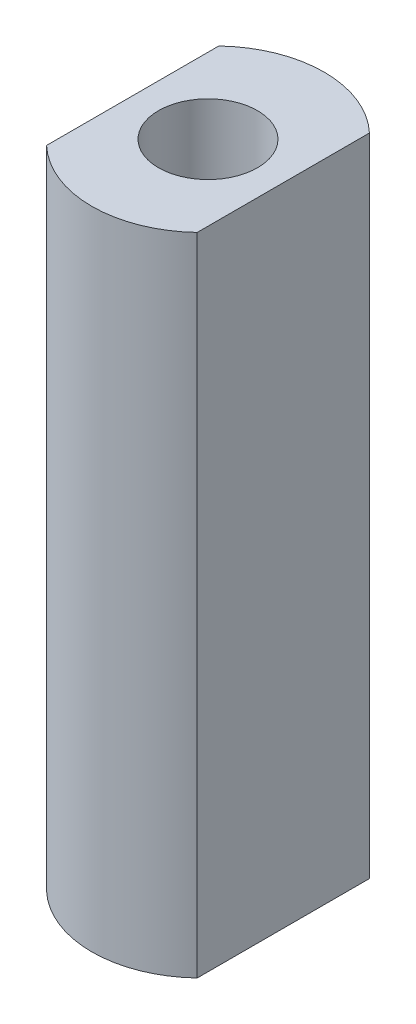
ISO-10303-21;
HEADER;
FILE_DESCRIPTION(('STEP AP214'),'2;1');
FILE_NAME('part.step','',(''),(''),'','','');
FILE_SCHEMA(('AUTOMOTIVE_DESIGN { 1 0 10303 214 1 1 1 1 }'));
ENDSEC;
DATA;
#1=APPLICATION_CONTEXT('core data for automotive mechanical design processes');
#2=APPLICATION_PROTOCOL_DEFINITION('international standard','automotive_design',2000,#1);
#3=PRODUCT_CONTEXT('',#1,'mechanical');
#4=PRODUCT('Part','Part','',(#3));
#5=PRODUCT_RELATED_PRODUCT_CATEGORY('part','',(#4));
#6=PRODUCT_DEFINITION_FORMATION('','',#4);
#7=PRODUCT_DEFINITION_CONTEXT('part definition',#1,'design');
#8=PRODUCT_DEFINITION('design','',#6,#7);
#9=PRODUCT_DEFINITION_SHAPE('','',#8);
#10=(LENGTH_UNIT() NAMED_UNIT(*) SI_UNIT(.MILLI.,.METRE.));
#11=(NAMED_UNIT(*) PLANE_ANGLE_UNIT() SI_UNIT($,.RADIAN.));
#12=(NAMED_UNIT(*) SI_UNIT($,.STERADIAN.) SOLID_ANGLE_UNIT());
#13=UNCERTAINTY_MEASURE_WITH_UNIT(LENGTH_MEASURE(1.E-05),#10,'distance_accuracy_value','');
#14=(GEOMETRIC_REPRESENTATION_CONTEXT(3) GLOBAL_UNCERTAINTY_ASSIGNED_CONTEXT((#13)) GLOBAL_UNIT_ASSIGNED_CONTEXT((#10,
#11,#12)) REPRESENTATION_CONTEXT('',''));
#15=CARTESIAN_POINT('',(0.,0.,0.));
#16=DIRECTION('',(0.,0.,1.));
#17=DIRECTION('',(1.,0.,0.));
#18=AXIS2_PLACEMENT_3D('',#15,#16,#17);
#19=CARTESIAN_POINT('',(0.,15.,-0.162500000000001));
#20=DIRECTION('',(0.,-1.,0.));
#21=DIRECTION('',(0.,0.,-1.));
#22=AXIS2_PLACEMENT_3D('',#19,#20,#21);
#23=PLANE('',#22);
#24=CARTESIAN_POINT('',(0.,15.,-0.162500000000001));
#25=DIRECTION('',(0.,1.,0.));
#26=DIRECTION('',(0.,0.,-1.));
#27=AXIS2_PLACEMENT_3D('',#24,#25,#26);
#28=CIRCLE('',#27,2.5375);
#29=CARTESIAN_POINT('',(1.75,15.,-2.));
#30=VERTEX_POINT('',#29);
#31=CARTESIAN_POINT('',(-1.75,15.,-2.));
#32=VERTEX_POINT('',#31);
#33=EDGE_CURVE('E85',#30,#32,#28,.T.);
#34=ORIENTED_EDGE('',*,*,#33,.T.);
#35=DIRECTION('',(0.,0.,1.));
#36=VECTOR('',#35,1.);
#37=CARTESIAN_POINT('',(-1.75,15.,-2.));
#38=LINE('',#37,#36);
#39=CARTESIAN_POINT('',(-1.75,15.,2.));
#40=VERTEX_POINT('',#39);
#41=EDGE_CURVE('E80',#32,#40,#38,.T.);
#42=ORIENTED_EDGE('',*,*,#41,.T.);
#43=CARTESIAN_POINT('',(0.,15.,0.162500000000001));
#44=DIRECTION('',(0.,1.,0.));
#45=DIRECTION('',(0.,0.,1.));
#46=AXIS2_PLACEMENT_3D('',#43,#44,#45);
#47=CIRCLE('',#46,2.5375);
#48=CARTESIAN_POINT('',(1.75,15.,2.));
#49=VERTEX_POINT('',#48);
#50=EDGE_CURVE('E83',#40,#49,#47,.T.);
#51=ORIENTED_EDGE('',*,*,#50,.T.);
#52=DIRECTION('',(0.,0.,-1.));
#53=VECTOR('',#52,1.);
#54=CARTESIAN_POINT('',(1.75,15.,-2.));
#55=LINE('',#54,#53);
#56=EDGE_CURVE('E50',#49,#30,#55,.T.);
#57=ORIENTED_EDGE('',*,*,#56,.T.);
#58=EDGE_LOOP('',(#34,#42,#51,#57));
#59=FACE_BOUND('',#58,.T.);
#60=CARTESIAN_POINT('',(0.,15.,0.));
#61=DIRECTION('',(0.,1.,0.));
#62=DIRECTION('',(0.,0.,1.));
#63=AXIS2_PLACEMENT_3D('',#60,#61,#62);
#64=CIRCLE('',#63,1.15);
#65=CARTESIAN_POINT('',(0.,15.,1.15));
#66=VERTEX_POINT('',#65);
#67=EDGE_CURVE('E100',#66,#66,#64,.T.);
#68=ORIENTED_EDGE('',*,*,#67,.F.);
#69=EDGE_LOOP('',(#68));
#70=FACE_BOUND('',#69,.T.);
#71=ADVANCED_FACE('F33',(#59,#70),#23,.F.);
#72=CARTESIAN_POINT('',(0.,0.,-0.162500000000001));
#73=DIRECTION('',(0.,-1.,0.));
#74=DIRECTION('',(0.,0.,-1.));
#75=AXIS2_PLACEMENT_3D('',#72,#73,#74);
#76=PLANE('',#75);
#77=CARTESIAN_POINT('',(0.,0.,-0.162500000000001));
#78=DIRECTION('',(0.,1.,0.));
#79=DIRECTION('',(0.,0.,-1.));
#80=AXIS2_PLACEMENT_3D('',#77,#78,#79);
#81=CIRCLE('',#80,2.5375);
#82=CARTESIAN_POINT('',(1.75,0.,-2.));
#83=VERTEX_POINT('',#82);
#84=CARTESIAN_POINT('',(-1.75,0.,-2.));
#85=VERTEX_POINT('',#84);
#86=EDGE_CURVE('E97',#83,#85,#81,.T.);
#87=ORIENTED_EDGE('',*,*,#86,.F.);
#88=DIRECTION('',(0.,0.,-1.));
#89=VECTOR('',#88,1.);
#90=CARTESIAN_POINT('',(1.75,0.,-2.));
#91=LINE('',#90,#89);
#92=CARTESIAN_POINT('',(1.75,0.,2.));
#93=VERTEX_POINT('',#92);
#94=EDGE_CURVE('E73',#93,#83,#91,.T.);
#95=ORIENTED_EDGE('',*,*,#94,.F.);
#96=CARTESIAN_POINT('',(0.,0.,0.162500000000001));
#97=DIRECTION('',(0.,1.,0.));
#98=DIRECTION('',(0.,0.,1.));
#99=AXIS2_PLACEMENT_3D('',#96,#97,#98);
#100=CIRCLE('',#99,2.5375);
#101=CARTESIAN_POINT('',(-1.75,0.,2.));
#102=VERTEX_POINT('',#101);
#103=EDGE_CURVE('E67',#102,#93,#100,.T.);
#104=ORIENTED_EDGE('',*,*,#103,.F.);
#105=DIRECTION('',(0.,0.,1.));
#106=VECTOR('',#105,1.);
#107=CARTESIAN_POINT('',(-1.75,0.,-2.));
#108=LINE('',#107,#106);
#109=EDGE_CURVE('E89',#85,#102,#108,.T.);
#110=ORIENTED_EDGE('',*,*,#109,.F.);
#111=EDGE_LOOP('',(#87,#95,#104,#110));
#112=FACE_BOUND('',#111,.T.);
#113=CARTESIAN_POINT('',(0.,0.,0.));
#114=DIRECTION('',(0.,1.,0.));
#115=DIRECTION('',(0.,0.,1.));
#116=AXIS2_PLACEMENT_3D('',#113,#114,#115);
#117=CIRCLE('',#116,1.15);
#118=CARTESIAN_POINT('',(0.,0.,1.15));
#119=VERTEX_POINT('',#118);
#120=EDGE_CURVE('E112',#119,#119,#117,.T.);
#121=ORIENTED_EDGE('',*,*,#120,.T.);
#122=EDGE_LOOP('',(#121));
#123=FACE_BOUND('',#122,.T.);
#124=ADVANCED_FACE('F108',(#112,#123),#76,.T.);
#125=CARTESIAN_POINT('',(0.,15.,-0.162500000000001));
#126=DIRECTION('',(0.,-1.,0.));
#127=DIRECTION('',(0.,0.,-1.));
#128=AXIS2_PLACEMENT_3D('',#125,#126,#127);
#129=CYLINDRICAL_SURFACE('',#128,2.5375);
#130=ORIENTED_EDGE('',*,*,#86,.T.);
#131=DIRECTION('',(0.,-1.,0.));
#132=VECTOR('',#131,1.);
#133=CARTESIAN_POINT('',(-1.75,15.,-2.));
#134=LINE('',#133,#132);
#135=EDGE_CURVE('E11',#32,#85,#134,.T.);
#136=ORIENTED_EDGE('',*,*,#135,.F.);
#137=ORIENTED_EDGE('',*,*,#33,.F.);
#138=DIRECTION('',(0.,-1.,0.));
#139=VECTOR('',#138,1.);
#140=CARTESIAN_POINT('',(1.75,15.,-2.));
#141=LINE('',#140,#139);
#142=EDGE_CURVE('E93',#30,#83,#141,.T.);
#143=ORIENTED_EDGE('',*,*,#142,.T.);
#144=EDGE_LOOP('',(#130,#136,#137,#143));
#145=FACE_BOUND('',#144,.T.);
#146=ADVANCED_FACE('F35',(#145),#129,.T.);
#147=CARTESIAN_POINT('',(-1.75,15.,-2.));
#148=DIRECTION('',(1.,0.,0.));
#149=DIRECTION('',(0.,0.,-1.));
#150=AXIS2_PLACEMENT_3D('',#147,#148,#149);
#151=PLANE('',#150);
#152=ORIENTED_EDGE('',*,*,#109,.T.);
#153=DIRECTION('',(0.,-1.,0.));
#154=VECTOR('',#153,1.);
#155=CARTESIAN_POINT('',(-1.75,15.,2.));
#156=LINE('',#155,#154);
#157=EDGE_CURVE('E42',#40,#102,#156,.T.);
#158=ORIENTED_EDGE('',*,*,#157,.F.);
#159=ORIENTED_EDGE('',*,*,#41,.F.);
#160=ORIENTED_EDGE('',*,*,#135,.T.);
#161=EDGE_LOOP('',(#152,#158,#159,#160));
#162=FACE_BOUND('',#161,.T.);
#163=ADVANCED_FACE('F88',(#162),#151,.F.);
#164=CARTESIAN_POINT('',(0.,15.,0.162500000000001));
#165=DIRECTION('',(0.,-1.,0.));
#166=DIRECTION('',(0.,0.,-1.));
#167=AXIS2_PLACEMENT_3D('',#164,#165,#166);
#168=CYLINDRICAL_SURFACE('',#167,2.5375);
#169=ORIENTED_EDGE('',*,*,#103,.T.);
#170=DIRECTION('',(0.,-1.,0.));
#171=VECTOR('',#170,1.);
#172=CARTESIAN_POINT('',(1.75,15.,2.));
#173=LINE('',#172,#171);
#174=EDGE_CURVE('E90',#49,#93,#173,.T.);
#175=ORIENTED_EDGE('',*,*,#174,.F.);
#176=ORIENTED_EDGE('',*,*,#50,.F.);
#177=ORIENTED_EDGE('',*,*,#157,.T.);
#178=EDGE_LOOP('',(#169,#175,#176,#177));
#179=FACE_BOUND('',#178,.T.);
#180=ADVANCED_FACE('F91',(#179),#168,.T.);
#181=CARTESIAN_POINT('',(1.75,15.,-2.));
#182=DIRECTION('',(-1.,0.,0.));
#183=DIRECTION('',(0.,0.,1.));
#184=AXIS2_PLACEMENT_3D('',#181,#182,#183);
#185=PLANE('',#184);
#186=ORIENTED_EDGE('',*,*,#94,.T.);
#187=ORIENTED_EDGE('',*,*,#142,.F.);
#188=ORIENTED_EDGE('',*,*,#56,.F.);
#189=ORIENTED_EDGE('',*,*,#174,.T.);
#190=EDGE_LOOP('',(#186,#187,#188,#189));
#191=FACE_BOUND('',#190,.T.);
#192=ADVANCED_FACE('F105',(#191),#185,.F.);
#193=CARTESIAN_POINT('',(0.,15.,0.));
#194=DIRECTION('',(0.,-1.,0.));
#195=DIRECTION('',(0.,0.,-1.));
#196=AXIS2_PLACEMENT_3D('',#193,#194,#195);
#197=CYLINDRICAL_SURFACE('',#196,1.15);
#198=ORIENTED_EDGE('',*,*,#67,.T.);
#199=EDGE_LOOP('',(#198));
#200=FACE_BOUND('',#199,.T.);
#201=ORIENTED_EDGE('',*,*,#120,.F.);
#202=EDGE_LOOP('',(#201));
#203=FACE_BOUND('',#202,.T.);
#204=ADVANCED_FACE('F118',(#200,#203),#197,.F.);
#205=CLOSED_SHELL('',(#71,#124,#146,#163,#180,#192,#204));
#206=MANIFOLD_SOLID_BREP('B2',#205);
#207=ADVANCED_BREP_SHAPE_REPRESENTATION('',(#18,#206),#14);
#208=SHAPE_DEFINITION_REPRESENTATION(#9,#207);
ENDSEC;
END-ISO-10303-21;
